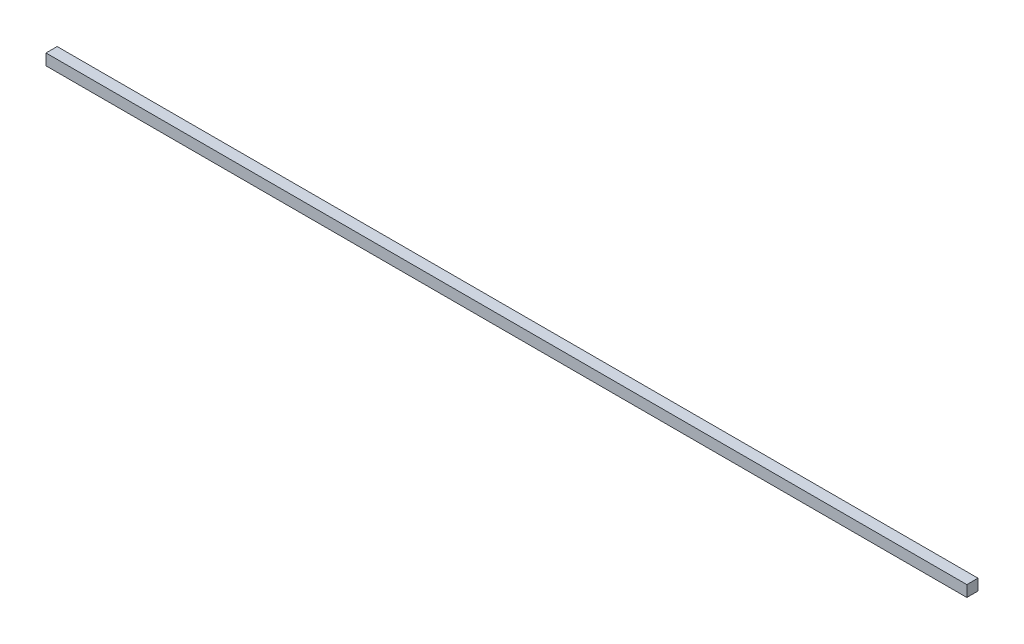
ISO-10303-21;
HEADER;
FILE_DESCRIPTION(('STEP AP214'),'2;1');
FILE_NAME('part.step','',(''),(''),'','','');
FILE_SCHEMA(('AUTOMOTIVE_DESIGN { 1 0 10303 214 1 1 1 1 }'));
ENDSEC;
DATA;
#1=APPLICATION_CONTEXT('core data for automotive mechanical design processes');
#2=APPLICATION_PROTOCOL_DEFINITION('international standard','automotive_design',2000,#1);
#3=PRODUCT_CONTEXT('',#1,'mechanical');
#4=PRODUCT('Part','Part','',(#3));
#5=PRODUCT_RELATED_PRODUCT_CATEGORY('part','',(#4));
#6=PRODUCT_DEFINITION_FORMATION('','',#4);
#7=PRODUCT_DEFINITION_CONTEXT('part definition',#1,'design');
#8=PRODUCT_DEFINITION('design','',#6,#7);
#9=PRODUCT_DEFINITION_SHAPE('','',#8);
#10=(LENGTH_UNIT() NAMED_UNIT(*) SI_UNIT(.MILLI.,.METRE.));
#11=(NAMED_UNIT(*) PLANE_ANGLE_UNIT() SI_UNIT($,.RADIAN.));
#12=(NAMED_UNIT(*) SI_UNIT($,.STERADIAN.) SOLID_ANGLE_UNIT());
#13=UNCERTAINTY_MEASURE_WITH_UNIT(LENGTH_MEASURE(1.E-05),#10,'distance_accuracy_value','');
#14=(GEOMETRIC_REPRESENTATION_CONTEXT(3) GLOBAL_UNCERTAINTY_ASSIGNED_CONTEXT((#13)) GLOBAL_UNIT_ASSIGNED_CONTEXT((#10,
#11,#12)) REPRESENTATION_CONTEXT('',''));
#15=CARTESIAN_POINT('',(0.,0.,0.));
#16=DIRECTION('',(0.,0.,1.));
#17=DIRECTION('',(1.,0.,0.));
#18=AXIS2_PLACEMENT_3D('',#15,#16,#17);
#19=CARTESIAN_POINT('',(-10.,2.,34.));
#20=DIRECTION('',(1.,0.,0.));
#21=DIRECTION('',(0.,0.,-1.));
#22=AXIS2_PLACEMENT_3D('',#19,#20,#21);
#23=PLANE('',#22);
#24=DIRECTION('',(0.,-1.,0.));
#25=VECTOR('',#24,1.);
#26=CARTESIAN_POINT('',(-10.,2.,26.));
#27=LINE('',#26,#25);
#28=CARTESIAN_POINT('',(-10.,10.,26.));
#29=VERTEX_POINT('',#28);
#30=CARTESIAN_POINT('',(-10.,2.,26.));
#31=VERTEX_POINT('',#30);
#32=EDGE_CURVE('E102',#29,#31,#27,.T.);
#33=ORIENTED_EDGE('',*,*,#32,.T.);
#34=DIRECTION('',(0.,0.,-1.));
#35=VECTOR('',#34,1.);
#36=CARTESIAN_POINT('',(-10.,2.,34.));
#37=LINE('',#36,#35);
#38=CARTESIAN_POINT('',(-10.,2.,34.));
#39=VERTEX_POINT('',#38);
#40=EDGE_CURVE('E11',#39,#31,#37,.T.);
#41=ORIENTED_EDGE('',*,*,#40,.F.);
#42=DIRECTION('',(0.,-1.,0.));
#43=VECTOR('',#42,1.);
#44=CARTESIAN_POINT('',(-10.,2.,34.));
#45=LINE('',#44,#43);
#46=CARTESIAN_POINT('',(-10.,10.,34.));
#47=VERTEX_POINT('',#46);
#48=EDGE_CURVE('E90',#47,#39,#45,.T.);
#49=ORIENTED_EDGE('',*,*,#48,.F.);
#50=DIRECTION('',(0.,0.,-1.));
#51=VECTOR('',#50,1.);
#52=CARTESIAN_POINT('',(-10.,10.,34.));
#53=LINE('',#52,#51);
#54=EDGE_CURVE('E98',#47,#29,#53,.T.);
#55=ORIENTED_EDGE('',*,*,#54,.T.);
#56=EDGE_LOOP('',(#33,#41,#49,#55));
#57=FACE_BOUND('',#56,.T.);
#58=ADVANCED_FACE('F39',(#57),#23,.F.);
#59=CARTESIAN_POINT('',(-10.,2.,34.));
#60=DIRECTION('',(0.,1.,0.));
#61=DIRECTION('',(0.,0.,1.));
#62=AXIS2_PLACEMENT_3D('',#59,#60,#61);
#63=PLANE('',#62);
#64=DIRECTION('',(1.,0.,0.));
#65=VECTOR('',#64,1.);
#66=CARTESIAN_POINT('',(-10.,2.,26.));
#67=LINE('',#66,#65);
#68=CARTESIAN_POINT('',(650.,2.,26.));
#69=VERTEX_POINT('',#68);
#70=EDGE_CURVE('E94',#31,#69,#67,.T.);
#71=ORIENTED_EDGE('',*,*,#70,.T.);
#72=DIRECTION('',(0.,0.,-1.));
#73=VECTOR('',#72,1.);
#74=CARTESIAN_POINT('',(650.,2.,34.));
#75=LINE('',#74,#73);
#76=CARTESIAN_POINT('',(650.,2.,34.));
#77=VERTEX_POINT('',#76);
#78=EDGE_CURVE('E47',#77,#69,#75,.T.);
#79=ORIENTED_EDGE('',*,*,#78,.F.);
#80=DIRECTION('',(1.,0.,0.));
#81=VECTOR('',#80,1.);
#82=CARTESIAN_POINT('',(-10.,2.,34.));
#83=LINE('',#82,#81);
#84=EDGE_CURVE('E85',#39,#77,#83,.T.);
#85=ORIENTED_EDGE('',*,*,#84,.F.);
#86=ORIENTED_EDGE('',*,*,#40,.T.);
#87=EDGE_LOOP('',(#71,#79,#85,#86));
#88=FACE_BOUND('',#87,.T.);
#89=ADVANCED_FACE('F93',(#88),#63,.F.);
#90=CARTESIAN_POINT('',(650.,2.,34.));
#91=DIRECTION('',(-1.,0.,0.));
#92=DIRECTION('',(0.,0.,1.));
#93=AXIS2_PLACEMENT_3D('',#90,#91,#92);
#94=PLANE('',#93);
#95=DIRECTION('',(0.,1.,0.));
#96=VECTOR('',#95,1.);
#97=CARTESIAN_POINT('',(650.,2.,26.));
#98=LINE('',#97,#96);
#99=CARTESIAN_POINT('',(650.,10.,26.));
#100=VERTEX_POINT('',#99);
#101=EDGE_CURVE('E72',#69,#100,#98,.T.);
#102=ORIENTED_EDGE('',*,*,#101,.T.);
#103=DIRECTION('',(0.,0.,-1.));
#104=VECTOR('',#103,1.);
#105=CARTESIAN_POINT('',(650.,10.,34.));
#106=LINE('',#105,#104);
#107=CARTESIAN_POINT('',(650.,10.,34.));
#108=VERTEX_POINT('',#107);
#109=EDGE_CURVE('E95',#108,#100,#106,.T.);
#110=ORIENTED_EDGE('',*,*,#109,.F.);
#111=DIRECTION('',(0.,1.,0.));
#112=VECTOR('',#111,1.);
#113=CARTESIAN_POINT('',(650.,2.,34.));
#114=LINE('',#113,#112);
#115=EDGE_CURVE('E88',#77,#108,#114,.T.);
#116=ORIENTED_EDGE('',*,*,#115,.F.);
#117=ORIENTED_EDGE('',*,*,#78,.T.);
#118=EDGE_LOOP('',(#102,#110,#116,#117));
#119=FACE_BOUND('',#118,.T.);
#120=ADVANCED_FACE('F96',(#119),#94,.F.);
#121=CARTESIAN_POINT('',(-10.,10.,34.));
#122=DIRECTION('',(0.,-1.,0.));
#123=DIRECTION('',(0.,0.,-1.));
#124=AXIS2_PLACEMENT_3D('',#121,#122,#123);
#125=PLANE('',#124);
#126=DIRECTION('',(-1.,0.,0.));
#127=VECTOR('',#126,1.);
#128=CARTESIAN_POINT('',(-10.,10.,26.));
#129=LINE('',#128,#127);
#130=EDGE_CURVE('E78',#100,#29,#129,.T.);
#131=ORIENTED_EDGE('',*,*,#130,.T.);
#132=ORIENTED_EDGE('',*,*,#54,.F.);
#133=DIRECTION('',(-1.,0.,0.));
#134=VECTOR('',#133,1.);
#135=CARTESIAN_POINT('',(-10.,10.,34.));
#136=LINE('',#135,#134);
#137=EDGE_CURVE('E55',#108,#47,#136,.T.);
#138=ORIENTED_EDGE('',*,*,#137,.F.);
#139=ORIENTED_EDGE('',*,*,#109,.T.);
#140=EDGE_LOOP('',(#131,#132,#138,#139));
#141=FACE_BOUND('',#140,.T.);
#142=ADVANCED_FACE('F109',(#141),#125,.F.);
#143=CARTESIAN_POINT('',(0.,0.,34.));
#144=DIRECTION('',(0.,0.,-1.));
#145=DIRECTION('',(-1.,0.,0.));
#146=AXIS2_PLACEMENT_3D('',#143,#144,#145);
#147=PLANE('',#146);
#148=ORIENTED_EDGE('',*,*,#48,.T.);
#149=ORIENTED_EDGE('',*,*,#84,.T.);
#150=ORIENTED_EDGE('',*,*,#115,.T.);
#151=ORIENTED_EDGE('',*,*,#137,.T.);
#152=EDGE_LOOP('',(#148,#149,#150,#151));
#153=FACE_BOUND('',#152,.T.);
#154=ADVANCED_FACE('F86',(#153),#147,.F.);
#155=CARTESIAN_POINT('',(0.,0.,26.));
#156=DIRECTION('',(0.,0.,-1.));
#157=DIRECTION('',(-1.,0.,0.));
#158=AXIS2_PLACEMENT_3D('',#155,#156,#157);
#159=PLANE('',#158);
#160=ORIENTED_EDGE('',*,*,#32,.F.);
#161=ORIENTED_EDGE('',*,*,#130,.F.);
#162=ORIENTED_EDGE('',*,*,#101,.F.);
#163=ORIENTED_EDGE('',*,*,#70,.F.);
#164=EDGE_LOOP('',(#160,#161,#162,#163));
#165=FACE_BOUND('',#164,.T.);
#166=ADVANCED_FACE('F112',(#165),#159,.T.);
#167=CLOSED_SHELL('',(#58,#89,#120,#142,#154,#166));
#168=MANIFOLD_SOLID_BREP('B2',#167);
#169=ADVANCED_BREP_SHAPE_REPRESENTATION('',(#18,#168),#14);
#170=SHAPE_DEFINITION_REPRESENTATION(#9,#169);
ENDSEC;
END-ISO-10303-21;
